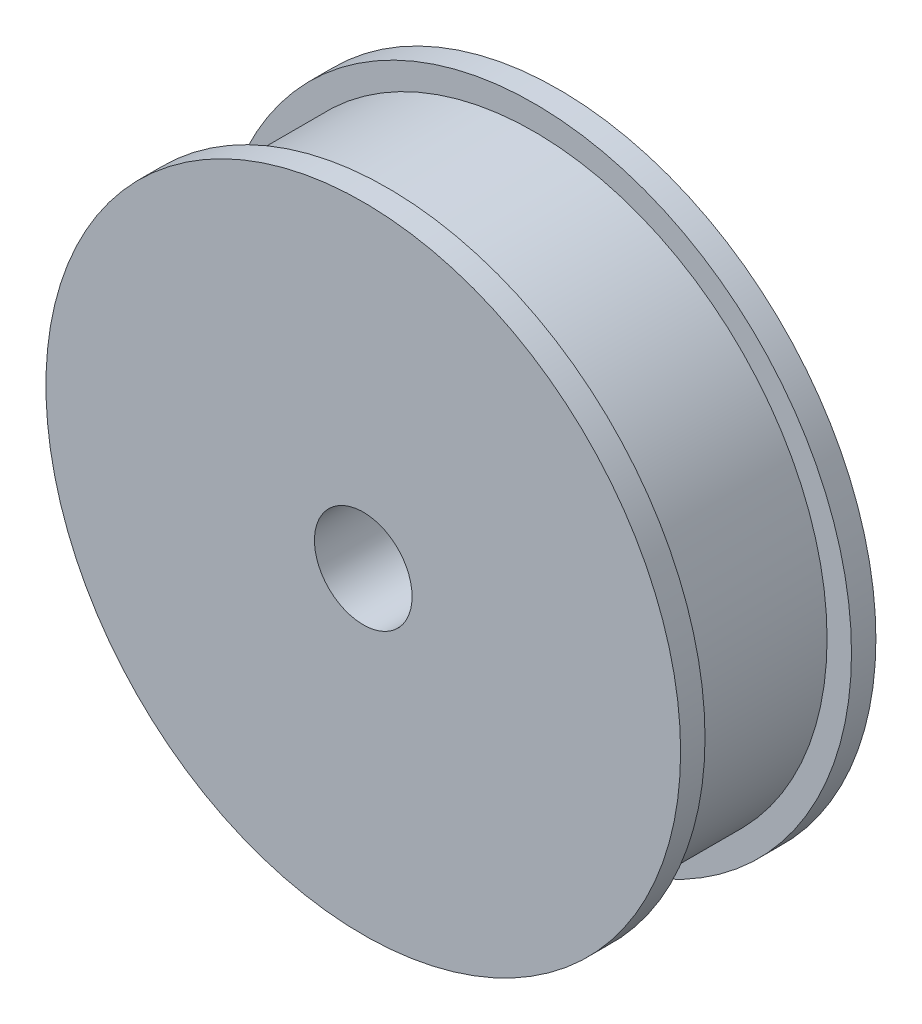
ISO-10303-21;
HEADER;
FILE_DESCRIPTION(('STEP AP214'),'2;1');
FILE_NAME('part.step','',(''),(''),'','','');
FILE_SCHEMA(('AUTOMOTIVE_DESIGN { 1 0 10303 214 1 1 1 1 }'));
ENDSEC;
DATA;
#1=APPLICATION_CONTEXT('core data for automotive mechanical design processes');
#2=APPLICATION_PROTOCOL_DEFINITION('international standard','automotive_design',2000,#1);
#3=PRODUCT_CONTEXT('',#1,'mechanical');
#4=PRODUCT('Part','Part','',(#3));
#5=PRODUCT_RELATED_PRODUCT_CATEGORY('part','',(#4));
#6=PRODUCT_DEFINITION_FORMATION('','',#4);
#7=PRODUCT_DEFINITION_CONTEXT('part definition',#1,'design');
#8=PRODUCT_DEFINITION('design','',#6,#7);
#9=PRODUCT_DEFINITION_SHAPE('','',#8);
#10=(LENGTH_UNIT() NAMED_UNIT(*) SI_UNIT(.MILLI.,.METRE.));
#11=(NAMED_UNIT(*) PLANE_ANGLE_UNIT() SI_UNIT($,.RADIAN.));
#12=(NAMED_UNIT(*) SI_UNIT($,.STERADIAN.) SOLID_ANGLE_UNIT());
#13=UNCERTAINTY_MEASURE_WITH_UNIT(LENGTH_MEASURE(1.E-05),#10,'distance_accuracy_value','');
#14=(GEOMETRIC_REPRESENTATION_CONTEXT(3) GLOBAL_UNCERTAINTY_ASSIGNED_CONTEXT((#13)) GLOBAL_UNIT_ASSIGNED_CONTEXT((#10,
#11,#12)) REPRESENTATION_CONTEXT('',''));
#15=CARTESIAN_POINT('',(0.,0.,0.));
#16=DIRECTION('',(0.,0.,1.));
#17=DIRECTION('',(1.,0.,0.));
#18=AXIS2_PLACEMENT_3D('',#15,#16,#17);
#19=CARTESIAN_POINT('',(0.,0.,12.));
#20=DIRECTION('',(0.,0.,-1.));
#21=DIRECTION('',(-1.,0.,0.));
#22=AXIS2_PLACEMENT_3D('',#19,#20,#21);
#23=CYLINDRICAL_SURFACE('',#22,19.5);
#24=CARTESIAN_POINT('',(0.,0.,10.5));
#25=DIRECTION('',(0.,0.,1.));
#26=DIRECTION('',(1.,0.,0.));
#27=AXIS2_PLACEMENT_3D('',#24,#25,#26);
#28=CIRCLE('',#27,19.5);
#29=CARTESIAN_POINT('',(19.5,0.,10.5));
#30=VERTEX_POINT('',#29);
#31=EDGE_CURVE('E41',#30,#30,#28,.T.);
#32=ORIENTED_EDGE('',*,*,#31,.T.);
#33=EDGE_LOOP('',(#32));
#34=FACE_BOUND('',#33,.T.);
#35=CARTESIAN_POINT('',(0.,0.,12.));
#36=DIRECTION('',(0.,0.,1.));
#37=DIRECTION('',(1.,0.,0.));
#38=AXIS2_PLACEMENT_3D('',#35,#36,#37);
#39=CIRCLE('',#38,19.5);
#40=CARTESIAN_POINT('',(19.5,0.,12.));
#41=VERTEX_POINT('',#40);
#42=EDGE_CURVE('E10',#41,#41,#39,.T.);
#43=ORIENTED_EDGE('',*,*,#42,.F.);
#44=EDGE_LOOP('',(#43));
#45=FACE_BOUND('',#44,.T.);
#46=ADVANCED_FACE('F31',(#34,#45),#23,.T.);
#47=CARTESIAN_POINT('',(0.,0.,12.));
#48=DIRECTION('',(0.,0.,1.));
#49=DIRECTION('',(1.,0.,0.));
#50=AXIS2_PLACEMENT_3D('',#47,#48,#49);
#51=PLANE('',#50);
#52=CARTESIAN_POINT('',(0.,0.,12.));
#53=DIRECTION('',(0.,0.,1.));
#54=DIRECTION('',(1.,0.,0.));
#55=AXIS2_PLACEMENT_3D('',#52,#53,#54);
#56=CIRCLE('',#55,3.);
#57=CARTESIAN_POINT('',(3.,0.,12.));
#58=VERTEX_POINT('',#57);
#59=EDGE_CURVE('E55',#58,#58,#56,.T.);
#60=ORIENTED_EDGE('',*,*,#59,.F.);
#61=EDGE_LOOP('',(#60));
#62=FACE_BOUND('',#61,.T.);
#63=ORIENTED_EDGE('',*,*,#42,.T.);
#64=EDGE_LOOP('',(#63));
#65=FACE_BOUND('',#64,.T.);
#66=ADVANCED_FACE('F71',(#62,#65),#51,.T.);
#67=CARTESIAN_POINT('',(0.,0.,10.5));
#68=DIRECTION('',(0.,0.,1.));
#69=DIRECTION('',(1.,0.,0.));
#70=AXIS2_PLACEMENT_3D('',#67,#68,#69);
#71=PLANE('',#70);
#72=ORIENTED_EDGE('',*,*,#31,.F.);
#73=EDGE_LOOP('',(#72));
#74=FACE_BOUND('',#73,.T.);
#75=CARTESIAN_POINT('',(0.,0.,10.5));
#76=DIRECTION('',(0.,0.,1.));
#77=DIRECTION('',(1.,0.,0.));
#78=AXIS2_PLACEMENT_3D('',#75,#76,#77);
#79=CIRCLE('',#78,18.);
#80=CARTESIAN_POINT('',(18.,0.,10.5));
#81=VERTEX_POINT('',#80);
#82=EDGE_CURVE('E45',#81,#81,#79,.T.);
#83=ORIENTED_EDGE('',*,*,#82,.T.);
#84=EDGE_LOOP('',(#83));
#85=FACE_BOUND('',#84,.T.);
#86=ADVANCED_FACE('F73',(#74,#85),#71,.F.);
#87=CARTESIAN_POINT('',(0.,0.,10.5));
#88=DIRECTION('',(0.,0.,-1.));
#89=DIRECTION('',(-1.,0.,0.));
#90=AXIS2_PLACEMENT_3D('',#87,#88,#89);
#91=CYLINDRICAL_SURFACE('',#90,18.);
#92=ORIENTED_EDGE('',*,*,#82,.F.);
#93=EDGE_LOOP('',(#92));
#94=FACE_BOUND('',#93,.T.);
#95=CARTESIAN_POINT('',(0.,0.,1.5));
#96=DIRECTION('',(0.,0.,1.));
#97=DIRECTION('',(1.,0.,0.));
#98=AXIS2_PLACEMENT_3D('',#95,#96,#97);
#99=CIRCLE('',#98,18.);
#100=CARTESIAN_POINT('',(18.,0.,1.5));
#101=VERTEX_POINT('',#100);
#102=EDGE_CURVE('E51',#101,#101,#99,.T.);
#103=ORIENTED_EDGE('',*,*,#102,.T.);
#104=EDGE_LOOP('',(#103));
#105=FACE_BOUND('',#104,.T.);
#106=ADVANCED_FACE('F79',(#94,#105),#91,.T.);
#107=CARTESIAN_POINT('',(0.,0.,1.5));
#108=DIRECTION('',(0.,0.,1.));
#109=DIRECTION('',(1.,0.,0.));
#110=AXIS2_PLACEMENT_3D('',#107,#108,#109);
#111=PLANE('',#110);
#112=ORIENTED_EDGE('',*,*,#102,.F.);
#113=EDGE_LOOP('',(#112));
#114=FACE_BOUND('',#113,.T.);
#115=CARTESIAN_POINT('',(0.,0.,1.5));
#116=DIRECTION('',(0.,0.,1.));
#117=DIRECTION('',(1.,0.,0.));
#118=AXIS2_PLACEMENT_3D('',#115,#116,#117);
#119=CIRCLE('',#118,19.5);
#120=CARTESIAN_POINT('',(19.5,0.,1.5));
#121=VERTEX_POINT('',#120);
#122=EDGE_CURVE('E48',#121,#121,#119,.T.);
#123=ORIENTED_EDGE('',*,*,#122,.T.);
#124=EDGE_LOOP('',(#123));
#125=FACE_BOUND('',#124,.T.);
#126=ADVANCED_FACE('F85',(#114,#125),#111,.T.);
#127=CARTESIAN_POINT('',(0.,0.,0.));
#128=DIRECTION('',(0.,0.,1.));
#129=DIRECTION('',(1.,0.,0.));
#130=AXIS2_PLACEMENT_3D('',#127,#128,#129);
#131=PLANE('',#130);
#132=CARTESIAN_POINT('',(0.,0.,0.));
#133=DIRECTION('',(0.,0.,1.));
#134=DIRECTION('',(1.,0.,0.));
#135=AXIS2_PLACEMENT_3D('',#132,#133,#134);
#136=CIRCLE('',#135,3.);
#137=CARTESIAN_POINT('',(3.,0.,0.));
#138=VERTEX_POINT('',#137);
#139=EDGE_CURVE('E54',#138,#138,#136,.T.);
#140=ORIENTED_EDGE('',*,*,#139,.T.);
#141=EDGE_LOOP('',(#140));
#142=FACE_BOUND('',#141,.T.);
#143=CARTESIAN_POINT('',(0.,0.,0.));
#144=DIRECTION('',(0.,0.,1.));
#145=DIRECTION('',(1.,0.,0.));
#146=AXIS2_PLACEMENT_3D('',#143,#144,#145);
#147=CIRCLE('',#146,19.5);
#148=CARTESIAN_POINT('',(19.5,0.,0.));
#149=VERTEX_POINT('',#148);
#150=EDGE_CURVE('E34',#149,#149,#147,.T.);
#151=ORIENTED_EDGE('',*,*,#150,.F.);
#152=EDGE_LOOP('',(#151));
#153=FACE_BOUND('',#152,.T.);
#154=ADVANCED_FACE('F61',(#142,#153),#131,.F.);
#155=ORIENTED_EDGE('',*,*,#150,.T.);
#156=EDGE_LOOP('',(#155));
#157=FACE_BOUND('',#156,.T.);
#158=ORIENTED_EDGE('',*,*,#122,.F.);
#159=EDGE_LOOP('',(#158));
#160=FACE_BOUND('',#159,.T.);
#161=ADVANCED_FACE('F67',(#157,#160),#23,.T.);
#162=CARTESIAN_POINT('',(0.,0.,0.));
#163=DIRECTION('',(0.,0.,1.));
#164=DIRECTION('',(1.,0.,0.));
#165=AXIS2_PLACEMENT_3D('',#162,#163,#164);
#166=CYLINDRICAL_SURFACE('',#165,3.);
#167=ORIENTED_EDGE('',*,*,#139,.F.);
#168=EDGE_LOOP('',(#167));
#169=FACE_BOUND('',#168,.T.);
#170=ORIENTED_EDGE('',*,*,#59,.T.);
#171=EDGE_LOOP('',(#170));
#172=FACE_BOUND('',#171,.T.);
#173=ADVANCED_FACE('F64',(#169,#172),#166,.F.);
#174=CLOSED_SHELL('',(#46,#66,#86,#106,#126,#154,#161,#173));
#175=MANIFOLD_SOLID_BREP('B2',#174);
#176=ADVANCED_BREP_SHAPE_REPRESENTATION('',(#18,#175),#14);
#177=SHAPE_DEFINITION_REPRESENTATION(#9,#176);
ENDSEC;
END-ISO-10303-21;
